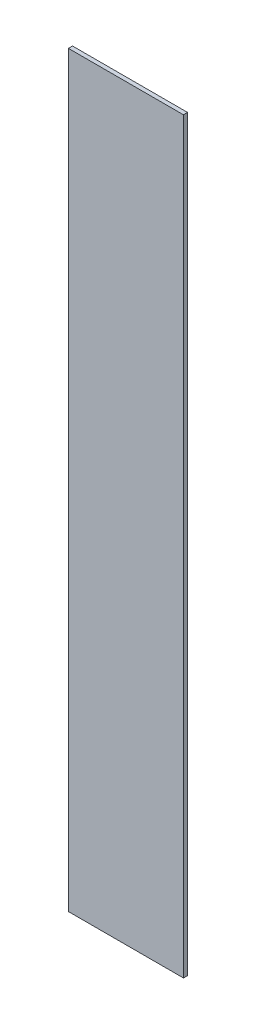
ISO-10303-21;
HEADER;
FILE_DESCRIPTION(('STEP AP214'),'2;1');
FILE_NAME('part.step','',(''),(''),'','','');
FILE_SCHEMA(('AUTOMOTIVE_DESIGN { 1 0 10303 214 1 1 1 1 }'));
ENDSEC;
DATA;
#1=APPLICATION_CONTEXT('core data for automotive mechanical design processes');
#2=APPLICATION_PROTOCOL_DEFINITION('international standard','automotive_design',2000,#1);
#3=PRODUCT_CONTEXT('',#1,'mechanical');
#4=PRODUCT('Part','Part','',(#3));
#5=PRODUCT_RELATED_PRODUCT_CATEGORY('part','',(#4));
#6=PRODUCT_DEFINITION_FORMATION('','',#4);
#7=PRODUCT_DEFINITION_CONTEXT('part definition',#1,'design');
#8=PRODUCT_DEFINITION('design','',#6,#7);
#9=PRODUCT_DEFINITION_SHAPE('','',#8);
#10=(LENGTH_UNIT() NAMED_UNIT(*) SI_UNIT(.MILLI.,.METRE.));
#11=(NAMED_UNIT(*) PLANE_ANGLE_UNIT() SI_UNIT($,.RADIAN.));
#12=(NAMED_UNIT(*) SI_UNIT($,.STERADIAN.) SOLID_ANGLE_UNIT());
#13=UNCERTAINTY_MEASURE_WITH_UNIT(LENGTH_MEASURE(1.E-05),#10,'distance_accuracy_value','');
#14=(GEOMETRIC_REPRESENTATION_CONTEXT(3) GLOBAL_UNCERTAINTY_ASSIGNED_CONTEXT((#13)) GLOBAL_UNIT_ASSIGNED_CONTEXT((#10,
#11,#12)) REPRESENTATION_CONTEXT('',''));
#15=CARTESIAN_POINT('',(0.,0.,0.));
#16=DIRECTION('',(0.,0.,1.));
#17=DIRECTION('',(1.,0.,0.));
#18=AXIS2_PLACEMENT_3D('',#15,#16,#17);
#19=CARTESIAN_POINT('',(623.,119.,27.));
#20=DIRECTION('',(1.,0.,0.));
#21=DIRECTION('',(0.,0.,-1.));
#22=AXIS2_PLACEMENT_3D('',#19,#20,#21);
#23=PLANE('',#22);
#24=DIRECTION('',(0.,-1.,0.));
#25=VECTOR('',#24,1.);
#26=CARTESIAN_POINT('',(623.,119.,26.));
#27=LINE('',#26,#25);
#28=CARTESIAN_POINT('',(623.,301.,26.));
#29=VERTEX_POINT('',#28);
#30=CARTESIAN_POINT('',(623.,119.,26.));
#31=VERTEX_POINT('',#30);
#32=EDGE_CURVE('E102',#29,#31,#27,.T.);
#33=ORIENTED_EDGE('',*,*,#32,.T.);
#34=DIRECTION('',(0.,0.,-1.));
#35=VECTOR('',#34,1.);
#36=CARTESIAN_POINT('',(623.,119.,27.));
#37=LINE('',#36,#35);
#38=CARTESIAN_POINT('',(623.,119.,27.));
#39=VERTEX_POINT('',#38);
#40=EDGE_CURVE('E11',#39,#31,#37,.T.);
#41=ORIENTED_EDGE('',*,*,#40,.F.);
#42=DIRECTION('',(0.,-1.,0.));
#43=VECTOR('',#42,1.);
#44=CARTESIAN_POINT('',(623.,119.,27.));
#45=LINE('',#44,#43);
#46=CARTESIAN_POINT('',(623.,301.,27.));
#47=VERTEX_POINT('',#46);
#48=EDGE_CURVE('E90',#47,#39,#45,.T.);
#49=ORIENTED_EDGE('',*,*,#48,.F.);
#50=DIRECTION('',(0.,0.,-1.));
#51=VECTOR('',#50,1.);
#52=CARTESIAN_POINT('',(623.,301.,27.));
#53=LINE('',#52,#51);
#54=EDGE_CURVE('E98',#47,#29,#53,.T.);
#55=ORIENTED_EDGE('',*,*,#54,.T.);
#56=EDGE_LOOP('',(#33,#41,#49,#55));
#57=FACE_BOUND('',#56,.T.);
#58=ADVANCED_FACE('F39',(#57),#23,.F.);
#59=CARTESIAN_POINT('',(623.,119.,27.));
#60=DIRECTION('',(0.,1.,0.));
#61=DIRECTION('',(0.,0.,1.));
#62=AXIS2_PLACEMENT_3D('',#59,#60,#61);
#63=PLANE('',#62);
#64=DIRECTION('',(1.,0.,0.));
#65=VECTOR('',#64,1.);
#66=CARTESIAN_POINT('',(623.,119.,26.));
#67=LINE('',#66,#65);
#68=CARTESIAN_POINT('',(651.,119.,26.));
#69=VERTEX_POINT('',#68);
#70=EDGE_CURVE('E94',#31,#69,#67,.T.);
#71=ORIENTED_EDGE('',*,*,#70,.T.);
#72=DIRECTION('',(0.,0.,-1.));
#73=VECTOR('',#72,1.);
#74=CARTESIAN_POINT('',(651.,119.,27.));
#75=LINE('',#74,#73);
#76=CARTESIAN_POINT('',(651.,119.,27.));
#77=VERTEX_POINT('',#76);
#78=EDGE_CURVE('E47',#77,#69,#75,.T.);
#79=ORIENTED_EDGE('',*,*,#78,.F.);
#80=DIRECTION('',(1.,0.,0.));
#81=VECTOR('',#80,1.);
#82=CARTESIAN_POINT('',(623.,119.,27.));
#83=LINE('',#82,#81);
#84=EDGE_CURVE('E85',#39,#77,#83,.T.);
#85=ORIENTED_EDGE('',*,*,#84,.F.);
#86=ORIENTED_EDGE('',*,*,#40,.T.);
#87=EDGE_LOOP('',(#71,#79,#85,#86));
#88=FACE_BOUND('',#87,.T.);
#89=ADVANCED_FACE('F93',(#88),#63,.F.);
#90=CARTESIAN_POINT('',(651.,119.,27.));
#91=DIRECTION('',(-1.,0.,0.));
#92=DIRECTION('',(0.,0.,1.));
#93=AXIS2_PLACEMENT_3D('',#90,#91,#92);
#94=PLANE('',#93);
#95=DIRECTION('',(0.,1.,0.));
#96=VECTOR('',#95,1.);
#97=CARTESIAN_POINT('',(651.,119.,26.));
#98=LINE('',#97,#96);
#99=CARTESIAN_POINT('',(651.,301.,26.));
#100=VERTEX_POINT('',#99);
#101=EDGE_CURVE('E72',#69,#100,#98,.T.);
#102=ORIENTED_EDGE('',*,*,#101,.T.);
#103=DIRECTION('',(0.,0.,-1.));
#104=VECTOR('',#103,1.);
#105=CARTESIAN_POINT('',(651.,301.,27.));
#106=LINE('',#105,#104);
#107=CARTESIAN_POINT('',(651.,301.,27.));
#108=VERTEX_POINT('',#107);
#109=EDGE_CURVE('E95',#108,#100,#106,.T.);
#110=ORIENTED_EDGE('',*,*,#109,.F.);
#111=DIRECTION('',(0.,1.,0.));
#112=VECTOR('',#111,1.);
#113=CARTESIAN_POINT('',(651.,119.,27.));
#114=LINE('',#113,#112);
#115=EDGE_CURVE('E88',#77,#108,#114,.T.);
#116=ORIENTED_EDGE('',*,*,#115,.F.);
#117=ORIENTED_EDGE('',*,*,#78,.T.);
#118=EDGE_LOOP('',(#102,#110,#116,#117));
#119=FACE_BOUND('',#118,.T.);
#120=ADVANCED_FACE('F96',(#119),#94,.F.);
#121=CARTESIAN_POINT('',(623.,301.,27.));
#122=DIRECTION('',(0.,-1.,0.));
#123=DIRECTION('',(0.,0.,-1.));
#124=AXIS2_PLACEMENT_3D('',#121,#122,#123);
#125=PLANE('',#124);
#126=DIRECTION('',(-1.,0.,0.));
#127=VECTOR('',#126,1.);
#128=CARTESIAN_POINT('',(623.,301.,26.));
#129=LINE('',#128,#127);
#130=EDGE_CURVE('E78',#100,#29,#129,.T.);
#131=ORIENTED_EDGE('',*,*,#130,.T.);
#132=ORIENTED_EDGE('',*,*,#54,.F.);
#133=DIRECTION('',(-1.,0.,0.));
#134=VECTOR('',#133,1.);
#135=CARTESIAN_POINT('',(623.,301.,27.));
#136=LINE('',#135,#134);
#137=EDGE_CURVE('E55',#108,#47,#136,.T.);
#138=ORIENTED_EDGE('',*,*,#137,.F.);
#139=ORIENTED_EDGE('',*,*,#109,.T.);
#140=EDGE_LOOP('',(#131,#132,#138,#139));
#141=FACE_BOUND('',#140,.T.);
#142=ADVANCED_FACE('F109',(#141),#125,.F.);
#143=CARTESIAN_POINT('',(0.,0.,27.));
#144=DIRECTION('',(0.,0.,-1.));
#145=DIRECTION('',(-1.,0.,0.));
#146=AXIS2_PLACEMENT_3D('',#143,#144,#145);
#147=PLANE('',#146);
#148=ORIENTED_EDGE('',*,*,#48,.T.);
#149=ORIENTED_EDGE('',*,*,#84,.T.);
#150=ORIENTED_EDGE('',*,*,#115,.T.);
#151=ORIENTED_EDGE('',*,*,#137,.T.);
#152=EDGE_LOOP('',(#148,#149,#150,#151));
#153=FACE_BOUND('',#152,.T.);
#154=ADVANCED_FACE('F86',(#153),#147,.F.);
#155=CARTESIAN_POINT('',(0.,0.,26.));
#156=DIRECTION('',(0.,0.,-1.));
#157=DIRECTION('',(-1.,0.,0.));
#158=AXIS2_PLACEMENT_3D('',#155,#156,#157);
#159=PLANE('',#158);
#160=ORIENTED_EDGE('',*,*,#32,.F.);
#161=ORIENTED_EDGE('',*,*,#130,.F.);
#162=ORIENTED_EDGE('',*,*,#101,.F.);
#163=ORIENTED_EDGE('',*,*,#70,.F.);
#164=EDGE_LOOP('',(#160,#161,#162,#163));
#165=FACE_BOUND('',#164,.T.);
#166=ADVANCED_FACE('F112',(#165),#159,.T.);
#167=CLOSED_SHELL('',(#58,#89,#120,#142,#154,#166));
#168=MANIFOLD_SOLID_BREP('B2',#167);
#169=ADVANCED_BREP_SHAPE_REPRESENTATION('',(#18,#168),#14);
#170=SHAPE_DEFINITION_REPRESENTATION(#9,#169);
ENDSEC;
END-ISO-10303-21;
